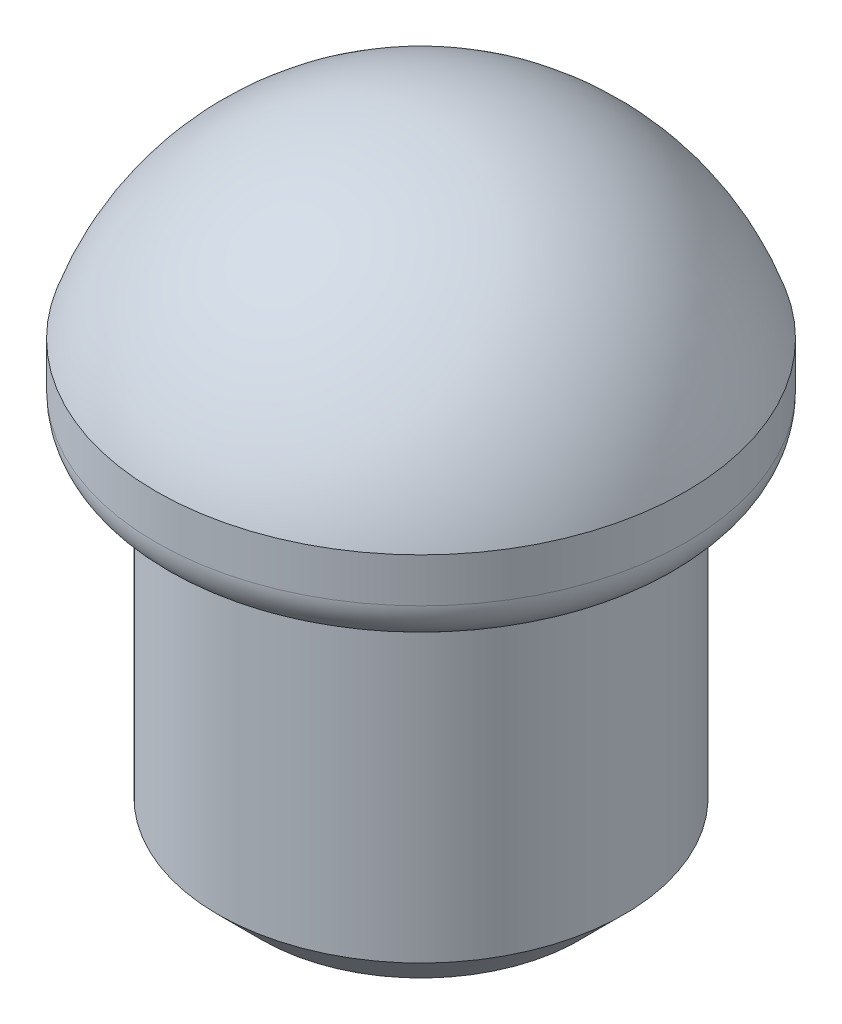
ISO-10303-21;
HEADER;
FILE_DESCRIPTION(('STEP AP214'),'2;1');
FILE_NAME('part.step','',(''),(''),'','','');
FILE_SCHEMA(('AUTOMOTIVE_DESIGN { 1 0 10303 214 1 1 1 1 }'));
ENDSEC;
DATA;
#1=APPLICATION_CONTEXT('core data for automotive mechanical design processes');
#2=APPLICATION_PROTOCOL_DEFINITION('international standard','automotive_design',2000,#1);
#3=PRODUCT_CONTEXT('',#1,'mechanical');
#4=PRODUCT('Part','Part','',(#3));
#5=PRODUCT_RELATED_PRODUCT_CATEGORY('part','',(#4));
#6=PRODUCT_DEFINITION_FORMATION('','',#4);
#7=PRODUCT_DEFINITION_CONTEXT('part definition',#1,'design');
#8=PRODUCT_DEFINITION('design','',#6,#7);
#9=PRODUCT_DEFINITION_SHAPE('','',#8);
#10=(LENGTH_UNIT() NAMED_UNIT(*) SI_UNIT(.MILLI.,.METRE.));
#11=(NAMED_UNIT(*) PLANE_ANGLE_UNIT() SI_UNIT($,.RADIAN.));
#12=(NAMED_UNIT(*) SI_UNIT($,.STERADIAN.) SOLID_ANGLE_UNIT());
#13=UNCERTAINTY_MEASURE_WITH_UNIT(LENGTH_MEASURE(1.E-05),#10,'distance_accuracy_value','');
#14=(GEOMETRIC_REPRESENTATION_CONTEXT(3) GLOBAL_UNCERTAINTY_ASSIGNED_CONTEXT((#13)) GLOBAL_UNIT_ASSIGNED_CONTEXT((#10,
#11,#12)) REPRESENTATION_CONTEXT('',''));
#15=CARTESIAN_POINT('',(0.,0.,0.));
#16=DIRECTION('',(0.,0.,1.));
#17=DIRECTION('',(1.,0.,0.));
#18=AXIS2_PLACEMENT_3D('',#15,#16,#17);
#19=CARTESIAN_POINT('',(0.,4.,0.));
#20=DIRECTION('',(0.,-1.,0.));
#21=DIRECTION('',(0.,0.,-1.));
#22=AXIS2_PLACEMENT_3D('',#19,#20,#21);
#23=CYLINDRICAL_SURFACE('',#22,2.3);
#24=CARTESIAN_POINT('',(0.,0.499999999999999,0.));
#25=DIRECTION('',(0.,1.,0.));
#26=DIRECTION('',(0.,0.,1.));
#27=AXIS2_PLACEMENT_3D('',#24,#25,#26);
#28=CIRCLE('',#27,2.3);
#29=CARTESIAN_POINT('',(0.,0.499999999999999,2.3));
#30=VERTEX_POINT('',#29);
#31=EDGE_CURVE('E38',#30,#30,#28,.T.);
#32=ORIENTED_EDGE('',*,*,#31,.T.);
#33=EDGE_LOOP('',(#32));
#34=FACE_BOUND('',#33,.T.);
#35=CARTESIAN_POINT('',(0.,4.,0.));
#36=DIRECTION('',(0.,1.,0.));
#37=DIRECTION('',(0.,0.,1.));
#38=AXIS2_PLACEMENT_3D('',#35,#36,#37);
#39=CIRCLE('',#38,2.3);
#40=CARTESIAN_POINT('',(0.,4.,2.3));
#41=VERTEX_POINT('',#40);
#42=EDGE_CURVE('E51',#41,#41,#39,.T.);
#43=ORIENTED_EDGE('',*,*,#42,.F.);
#44=EDGE_LOOP('',(#43));
#45=FACE_BOUND('',#44,.T.);
#46=ADVANCED_FACE('F31',(#34,#45),#23,.T.);
#47=CARTESIAN_POINT('',(0.,0.,0.));
#48=DIRECTION('',(0.,1.,0.));
#49=DIRECTION('',(0.,0.,1.));
#50=AXIS2_PLACEMENT_3D('',#47,#48,#49);
#51=PLANE('',#50);
#52=CARTESIAN_POINT('',(0.,0.,0.));
#53=DIRECTION('',(0.,1.,0.));
#54=DIRECTION('',(0.,0.,1.));
#55=AXIS2_PLACEMENT_3D('',#52,#53,#54);
#56=CIRCLE('',#55,1.8);
#57=CARTESIAN_POINT('',(0.,0.,1.8));
#58=VERTEX_POINT('',#57);
#59=EDGE_CURVE('E10',#58,#58,#56,.F.);
#60=ORIENTED_EDGE('',*,*,#59,.T.);
#61=EDGE_LOOP('',(#60));
#62=FACE_BOUND('',#61,.T.);
#63=ADVANCED_FACE('F62',(#62),#51,.F.);
#64=CARTESIAN_POINT('',(0.,4.,0.));
#65=DIRECTION('',(0.,-1.,0.));
#66=DIRECTION('',(1.,0.,0.));
#67=AXIS2_PLACEMENT_3D('',#64,#65,#66);
#68=SPHERICAL_SURFACE('',#67,3.16227766016838);
#69=CARTESIAN_POINT('',(0.,5.,0.));
#70=DIRECTION('',(0.,-1.,0.));
#71=DIRECTION('',(0.,0.,-1.));
#72=AXIS2_PLACEMENT_3D('',#69,#70,#71);
#73=CIRCLE('',#72,3.);
#74=CARTESIAN_POINT('',(0.,5.,-3.));
#75=VERTEX_POINT('',#74);
#76=EDGE_CURVE('E54',#75,#75,#73,.T.);
#77=ORIENTED_EDGE('',*,*,#76,.F.);
#78=EDGE_LOOP('',(#77));
#79=FACE_BOUND('',#78,.T.);
#80=ADVANCED_FACE('F60',(#79),#68,.T.);
#81=CARTESIAN_POINT('',(0.,-2.04048014645309,0.));
#82=DIRECTION('',(0.,-1.,0.));
#83=DIRECTION('',(0.,0.,-1.));
#84=AXIS2_PLACEMENT_3D('',#81,#82,#83);
#85=CYLINDRICAL_SURFACE('',#84,3.);
#86=CARTESIAN_POINT('',(0.,4.5,0.));
#87=DIRECTION('',(0.,1.,0.));
#88=DIRECTION('',(0.,0.,1.));
#89=AXIS2_PLACEMENT_3D('',#86,#87,#88);
#90=CIRCLE('',#89,3.);
#91=CARTESIAN_POINT('',(0.,4.5,3.));
#92=VERTEX_POINT('',#91);
#93=EDGE_CURVE('E42',#92,#92,#90,.T.);
#94=ORIENTED_EDGE('',*,*,#93,.T.);
#95=EDGE_LOOP('',(#94));
#96=FACE_BOUND('',#95,.T.);
#97=ORIENTED_EDGE('',*,*,#76,.T.);
#98=EDGE_LOOP('',(#97));
#99=FACE_BOUND('',#98,.T.);
#100=ADVANCED_FACE('F58',(#96,#99),#85,.T.);
#101=CARTESIAN_POINT('',(-3.,4.,0.));
#102=DIRECTION('',(0.,1.,0.));
#103=DIRECTION('',(0.,0.,1.));
#104=AXIS2_PLACEMENT_3D('',#101,#102,#103);
#105=PLANE('',#104);
#106=CARTESIAN_POINT('',(0.,4.,0.));
#107=DIRECTION('',(0.,1.,0.));
#108=DIRECTION('',(0.,0.,1.));
#109=AXIS2_PLACEMENT_3D('',#106,#107,#108);
#110=CIRCLE('',#109,2.5);
#111=CARTESIAN_POINT('',(0.,4.,2.5));
#112=VERTEX_POINT('',#111);
#113=EDGE_CURVE('E46',#112,#112,#110,.F.);
#114=ORIENTED_EDGE('',*,*,#113,.T.);
#115=EDGE_LOOP('',(#114));
#116=FACE_BOUND('',#115,.T.);
#117=ORIENTED_EDGE('',*,*,#42,.T.);
#118=EDGE_LOOP('',(#117));
#119=FACE_BOUND('',#118,.T.);
#120=ADVANCED_FACE('F68',(#116,#119),#105,.F.);
#121=CARTESIAN_POINT('',(0.,4.5,0.));
#122=DIRECTION('',(0.,1.,0.));
#123=DIRECTION('',(0.,0.,1.));
#124=AXIS2_PLACEMENT_3D('',#121,#122,#123);
#125=TOROIDAL_SURFACE('',#124,2.5,0.5);
#126=ORIENTED_EDGE('',*,*,#93,.F.);
#127=EDGE_LOOP('',(#126));
#128=FACE_BOUND('',#127,.T.);
#129=ORIENTED_EDGE('',*,*,#113,.F.);
#130=EDGE_LOOP('',(#129));
#131=FACE_BOUND('',#130,.T.);
#132=ADVANCED_FACE('F77',(#128,#131),#125,.T.);
#133=CARTESIAN_POINT('',(0.,0.499999999999999,0.));
#134=DIRECTION('',(0.,1.,0.));
#135=DIRECTION('',(0.,0.,1.));
#136=AXIS2_PLACEMENT_3D('',#133,#134,#135);
#137=CONICAL_SURFACE('',#136,2.3,0.785398163397451);
#138=ORIENTED_EDGE('',*,*,#59,.F.);
#139=EDGE_LOOP('',(#138));
#140=FACE_BOUND('',#139,.T.);
#141=ORIENTED_EDGE('',*,*,#31,.F.);
#142=EDGE_LOOP('',(#141));
#143=FACE_BOUND('',#142,.T.);
#144=ADVANCED_FACE('F33',(#140,#143),#137,.T.);
#145=CLOSED_SHELL('',(#46,#63,#80,#100,#120,#132,#144));
#146=MANIFOLD_SOLID_BREP('B2',#145);
#147=ADVANCED_BREP_SHAPE_REPRESENTATION('',(#18,#146),#14);
#148=SHAPE_DEFINITION_REPRESENTATION(#9,#147);
ENDSEC;
END-ISO-10303-21;
